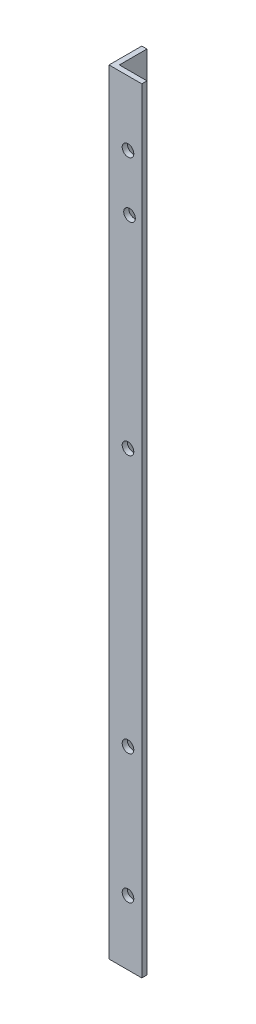
ISO-10303-21;
HEADER;
FILE_DESCRIPTION(('STEP AP214'),'2;1');
FILE_NAME('part.step','',(''),(''),'','','');
FILE_SCHEMA(('AUTOMOTIVE_DESIGN { 1 0 10303 214 1 1 1 1 }'));
ENDSEC;
DATA;
#1=APPLICATION_CONTEXT('core data for automotive mechanical design processes');
#2=APPLICATION_PROTOCOL_DEFINITION('international standard','automotive_design',2000,#1);
#3=PRODUCT_CONTEXT('',#1,'mechanical');
#4=PRODUCT('Part','Part','',(#3));
#5=PRODUCT_RELATED_PRODUCT_CATEGORY('part','',(#4));
#6=PRODUCT_DEFINITION_FORMATION('','',#4);
#7=PRODUCT_DEFINITION_CONTEXT('part definition',#1,'design');
#8=PRODUCT_DEFINITION('design','',#6,#7);
#9=PRODUCT_DEFINITION_SHAPE('','',#8);
#10=(LENGTH_UNIT() NAMED_UNIT(*) SI_UNIT(.MILLI.,.METRE.));
#11=(NAMED_UNIT(*) PLANE_ANGLE_UNIT() SI_UNIT($,.RADIAN.));
#12=(NAMED_UNIT(*) SI_UNIT($,.STERADIAN.) SOLID_ANGLE_UNIT());
#13=UNCERTAINTY_MEASURE_WITH_UNIT(LENGTH_MEASURE(1.E-05),#10,'distance_accuracy_value','');
#14=(GEOMETRIC_REPRESENTATION_CONTEXT(3) GLOBAL_UNCERTAINTY_ASSIGNED_CONTEXT((#13)) GLOBAL_UNIT_ASSIGNED_CONTEXT((#10,
#11,#12)) REPRESENTATION_CONTEXT('',''));
#15=CARTESIAN_POINT('',(0.,0.,0.));
#16=DIRECTION('',(0.,0.,1.));
#17=DIRECTION('',(1.,0.,0.));
#18=AXIS2_PLACEMENT_3D('',#15,#16,#17);
#19=CARTESIAN_POINT('',(0.,300.,0.));
#20=DIRECTION('',(1.,0.,0.));
#21=DIRECTION('',(0.,0.,-1.));
#22=AXIS2_PLACEMENT_3D('',#19,#20,#21);
#23=PLANE('',#22);
#24=CARTESIAN_POINT('',(0.,225.,-7.35000000000001));
#25=DIRECTION('',(1.,0.,0.));
#26=DIRECTION('',(0.,0.,-1.));
#27=AXIS2_PLACEMENT_3D('',#24,#25,#26);
#28=CIRCLE('',#27,2.25);
#29=CARTESIAN_POINT('',(0.,225.,-9.60000000000001));
#30=VERTEX_POINT('',#29);
#31=EDGE_CURVE('E167',#30,#30,#28,.T.);
#32=ORIENTED_EDGE('',*,*,#31,.T.);
#33=EDGE_LOOP('',(#32));
#34=FACE_BOUND('',#33,.T.);
#35=CARTESIAN_POINT('',(0.,125.,-7.35000000000001));
#36=DIRECTION('',(1.,0.,0.));
#37=DIRECTION('',(0.,0.,-1.));
#38=AXIS2_PLACEMENT_3D('',#35,#36,#37);
#39=CIRCLE('',#38,2.25);
#40=CARTESIAN_POINT('',(0.,125.,-9.60000000000001));
#41=VERTEX_POINT('',#40);
#42=EDGE_CURVE('E164',#41,#41,#39,.T.);
#43=ORIENTED_EDGE('',*,*,#42,.T.);
#44=EDGE_LOOP('',(#43));
#45=FACE_BOUND('',#44,.T.);
#46=CARTESIAN_POINT('',(0.,25.,-7.35000000000001));
#47=DIRECTION('',(1.,0.,0.));
#48=DIRECTION('',(0.,0.,-1.));
#49=AXIS2_PLACEMENT_3D('',#46,#47,#48);
#50=CIRCLE('',#49,2.25);
#51=CARTESIAN_POINT('',(0.,25.,-9.60000000000001));
#52=VERTEX_POINT('',#51);
#53=EDGE_CURVE('E156',#52,#52,#50,.T.);
#54=ORIENTED_EDGE('',*,*,#53,.T.);
#55=EDGE_LOOP('',(#54));
#56=FACE_BOUND('',#55,.T.);
#57=DIRECTION('',(0.,0.,1.));
#58=VECTOR('',#57,1.);
#59=CARTESIAN_POINT('',(0.,0.,0.));
#60=LINE('',#59,#58);
#61=CARTESIAN_POINT('',(0.,0.,-12.7));
#62=VERTEX_POINT('',#61);
#63=CARTESIAN_POINT('',(0.,0.,0.));
#64=VERTEX_POINT('',#63);
#65=EDGE_CURVE('E122',#62,#64,#60,.T.);
#66=ORIENTED_EDGE('',*,*,#65,.T.);
#67=DIRECTION('',(0.,-1.,0.));
#68=VECTOR('',#67,1.);
#69=CARTESIAN_POINT('',(0.,300.,0.));
#70=LINE('',#69,#68);
#71=CARTESIAN_POINT('',(0.,300.,0.));
#72=VERTEX_POINT('',#71);
#73=EDGE_CURVE('E11',#72,#64,#70,.T.);
#74=ORIENTED_EDGE('',*,*,#73,.F.);
#75=DIRECTION('',(0.,0.,1.));
#76=VECTOR('',#75,1.);
#77=CARTESIAN_POINT('',(0.,300.,0.));
#78=LINE('',#77,#76);
#79=CARTESIAN_POINT('',(0.,300.,-12.7));
#80=VERTEX_POINT('',#79);
#81=EDGE_CURVE('E133',#80,#72,#78,.T.);
#82=ORIENTED_EDGE('',*,*,#81,.F.);
#83=DIRECTION('',(0.,-1.,0.));
#84=VECTOR('',#83,1.);
#85=CARTESIAN_POINT('',(0.,300.,-12.7));
#86=LINE('',#85,#84);
#87=EDGE_CURVE('E118',#80,#62,#86,.T.);
#88=ORIENTED_EDGE('',*,*,#87,.T.);
#89=EDGE_LOOP('',(#66,#74,#82,#88));
#90=FACE_BOUND('',#89,.T.);
#91=ADVANCED_FACE('F36',(#34,#45,#56,#90),#23,.F.);
#92=CARTESIAN_POINT('',(0.,300.,0.));
#93=DIRECTION('',(0.,0.,-1.));
#94=DIRECTION('',(-1.,0.,0.));
#95=AXIS2_PLACEMENT_3D('',#92,#93,#94);
#96=PLANE('',#95);
#97=CARTESIAN_POINT('',(7.94000000000001,253.6,0.));
#98=DIRECTION('',(0.,0.,1.));
#99=DIRECTION('',(1.,0.,0.));
#100=AXIS2_PLACEMENT_3D('',#97,#98,#99);
#101=CIRCLE('',#100,2.25);
#102=CARTESIAN_POINT('',(10.19,253.6,0.));
#103=VERTEX_POINT('',#102);
#104=EDGE_CURVE('E140',#103,#103,#101,.T.);
#105=ORIENTED_EDGE('',*,*,#104,.F.);
#106=EDGE_LOOP('',(#105));
#107=FACE_BOUND('',#106,.T.);
#108=CARTESIAN_POINT('',(7.35000000000001,25.,0.));
#109=DIRECTION('',(0.,0.,1.));
#110=DIRECTION('',(1.,0.,0.));
#111=AXIS2_PLACEMENT_3D('',#108,#109,#110);
#112=CIRCLE('',#111,2.25);
#113=CARTESIAN_POINT('',(9.60000000000001,25.,0.));
#114=VERTEX_POINT('',#113);
#115=EDGE_CURVE('E146',#114,#114,#112,.T.);
#116=ORIENTED_EDGE('',*,*,#115,.F.);
#117=EDGE_LOOP('',(#116));
#118=FACE_BOUND('',#117,.T.);
#119=CARTESIAN_POINT('',(7.35,275.,0.));
#120=DIRECTION('',(0.,0.,-1.));
#121=DIRECTION('',(-1.,0.,0.));
#122=AXIS2_PLACEMENT_3D('',#119,#120,#121);
#123=CIRCLE('',#122,2.25);
#124=CARTESIAN_POINT('',(5.09999999999999,275.,0.));
#125=VERTEX_POINT('',#124);
#126=EDGE_CURVE('E126',#125,#125,#123,.T.);
#127=ORIENTED_EDGE('',*,*,#126,.T.);
#128=EDGE_LOOP('',(#127));
#129=FACE_BOUND('',#128,.T.);
#130=CARTESIAN_POINT('',(7.35,175.,0.));
#131=DIRECTION('',(0.,0.,-1.));
#132=DIRECTION('',(-1.,0.,0.));
#133=AXIS2_PLACEMENT_3D('',#130,#131,#132);
#134=CIRCLE('',#133,2.25);
#135=CARTESIAN_POINT('',(5.09999999999999,175.,0.));
#136=VERTEX_POINT('',#135);
#137=EDGE_CURVE('E182',#136,#136,#134,.T.);
#138=ORIENTED_EDGE('',*,*,#137,.T.);
#139=EDGE_LOOP('',(#138));
#140=FACE_BOUND('',#139,.T.);
#141=CARTESIAN_POINT('',(7.35,75.,0.));
#142=DIRECTION('',(0.,0.,-1.));
#143=DIRECTION('',(-1.,0.,0.));
#144=AXIS2_PLACEMENT_3D('',#141,#142,#143);
#145=CIRCLE('',#144,2.25);
#146=CARTESIAN_POINT('',(5.09999999999999,75.,0.));
#147=VERTEX_POINT('',#146);
#148=EDGE_CURVE('E174',#147,#147,#145,.T.);
#149=ORIENTED_EDGE('',*,*,#148,.T.);
#150=EDGE_LOOP('',(#149));
#151=FACE_BOUND('',#150,.T.);
#152=DIRECTION('',(1.,0.,0.));
#153=VECTOR('',#152,1.);
#154=CARTESIAN_POINT('',(0.,0.,0.));
#155=LINE('',#154,#153);
#156=CARTESIAN_POINT('',(12.7,0.,0.));
#157=VERTEX_POINT('',#156);
#158=EDGE_CURVE('E125',#64,#157,#155,.T.);
#159=ORIENTED_EDGE('',*,*,#158,.T.);
#160=DIRECTION('',(0.,-1.,0.));
#161=VECTOR('',#160,1.);
#162=CARTESIAN_POINT('',(12.7,300.,0.));
#163=LINE('',#162,#161);
#164=CARTESIAN_POINT('',(12.7,300.,0.));
#165=VERTEX_POINT('',#164);
#166=EDGE_CURVE('E45',#165,#157,#163,.T.);
#167=ORIENTED_EDGE('',*,*,#166,.F.);
#168=DIRECTION('',(1.,0.,0.));
#169=VECTOR('',#168,1.);
#170=CARTESIAN_POINT('',(0.,300.,0.));
#171=LINE('',#170,#169);
#172=EDGE_CURVE('E91',#72,#165,#171,.T.);
#173=ORIENTED_EDGE('',*,*,#172,.F.);
#174=ORIENTED_EDGE('',*,*,#73,.T.);
#175=EDGE_LOOP('',(#159,#167,#173,#174));
#176=FACE_BOUND('',#175,.T.);
#177=ADVANCED_FACE('F190',(#107,#118,#129,#140,#151,#176),#96,.F.);
#178=CARTESIAN_POINT('',(12.7,300.,0.));
#179=DIRECTION('',(-1.,0.,0.));
#180=DIRECTION('',(0.,0.,1.));
#181=AXIS2_PLACEMENT_3D('',#178,#179,#180);
#182=PLANE('',#181);
#183=DIRECTION('',(0.,0.,-1.));
#184=VECTOR('',#183,1.);
#185=CARTESIAN_POINT('',(12.7,0.,0.));
#186=LINE('',#185,#184);
#187=CARTESIAN_POINT('',(12.7,0.,-2.));
#188=VERTEX_POINT('',#187);
#189=EDGE_CURVE('E128',#157,#188,#186,.T.);
#190=ORIENTED_EDGE('',*,*,#189,.T.);
#191=DIRECTION('',(0.,-1.,0.));
#192=VECTOR('',#191,1.);
#193=CARTESIAN_POINT('',(12.7,300.,-2.));
#194=LINE('',#193,#192);
#195=CARTESIAN_POINT('',(12.7,300.,-2.));
#196=VERTEX_POINT('',#195);
#197=EDGE_CURVE('E113',#196,#188,#194,.T.);
#198=ORIENTED_EDGE('',*,*,#197,.F.);
#199=DIRECTION('',(0.,0.,-1.));
#200=VECTOR('',#199,1.);
#201=CARTESIAN_POINT('',(12.7,300.,0.));
#202=LINE('',#201,#200);
#203=EDGE_CURVE('E104',#165,#196,#202,.T.);
#204=ORIENTED_EDGE('',*,*,#203,.F.);
#205=ORIENTED_EDGE('',*,*,#166,.T.);
#206=EDGE_LOOP('',(#190,#198,#204,#205));
#207=FACE_BOUND('',#206,.T.);
#208=ADVANCED_FACE('F193',(#207),#182,.F.);
#209=CARTESIAN_POINT('',(2.,300.,-2.));
#210=DIRECTION('',(0.,0.,1.));
#211=DIRECTION('',(1.,0.,0.));
#212=AXIS2_PLACEMENT_3D('',#209,#210,#211);
#213=PLANE('',#212);
#214=CARTESIAN_POINT('',(7.94000000000001,253.6,-2.));
#215=DIRECTION('',(0.,0.,1.));
#216=DIRECTION('',(1.,0.,0.));
#217=AXIS2_PLACEMENT_3D('',#214,#215,#216);
#218=CIRCLE('',#217,2.25);
#219=CARTESIAN_POINT('',(10.19,253.6,-2.));
#220=VERTEX_POINT('',#219);
#221=EDGE_CURVE('E39',#220,#220,#218,.T.);
#222=ORIENTED_EDGE('',*,*,#221,.T.);
#223=EDGE_LOOP('',(#222));
#224=FACE_BOUND('',#223,.T.);
#225=CARTESIAN_POINT('',(7.35000000000001,25.,-2.));
#226=DIRECTION('',(0.,0.,1.));
#227=DIRECTION('',(1.,0.,0.));
#228=AXIS2_PLACEMENT_3D('',#225,#226,#227);
#229=CIRCLE('',#228,2.25);
#230=CARTESIAN_POINT('',(9.60000000000001,25.,-2.));
#231=VERTEX_POINT('',#230);
#232=EDGE_CURVE('E138',#231,#231,#229,.T.);
#233=ORIENTED_EDGE('',*,*,#232,.T.);
#234=EDGE_LOOP('',(#233));
#235=FACE_BOUND('',#234,.T.);
#236=CARTESIAN_POINT('',(7.35,275.,-2.));
#237=DIRECTION('',(0.,0.,-1.));
#238=DIRECTION('',(-1.,0.,0.));
#239=AXIS2_PLACEMENT_3D('',#236,#237,#238);
#240=CIRCLE('',#239,2.25);
#241=CARTESIAN_POINT('',(5.09999999999999,275.,-2.));
#242=VERTEX_POINT('',#241);
#243=EDGE_CURVE('E171',#242,#242,#240,.T.);
#244=ORIENTED_EDGE('',*,*,#243,.F.);
#245=EDGE_LOOP('',(#244));
#246=FACE_BOUND('',#245,.T.);
#247=CARTESIAN_POINT('',(7.35,175.,-2.));
#248=DIRECTION('',(0.,0.,-1.));
#249=DIRECTION('',(-1.,0.,0.));
#250=AXIS2_PLACEMENT_3D('',#247,#248,#249);
#251=CIRCLE('',#250,2.25);
#252=CARTESIAN_POINT('',(5.09999999999999,175.,-2.));
#253=VERTEX_POINT('',#252);
#254=EDGE_CURVE('E175',#253,#253,#251,.T.);
#255=ORIENTED_EDGE('',*,*,#254,.F.);
#256=EDGE_LOOP('',(#255));
#257=FACE_BOUND('',#256,.T.);
#258=CARTESIAN_POINT('',(7.35,75.,-2.));
#259=DIRECTION('',(0.,0.,-1.));
#260=DIRECTION('',(-1.,0.,0.));
#261=AXIS2_PLACEMENT_3D('',#258,#259,#260);
#262=CIRCLE('',#261,2.25);
#263=CARTESIAN_POINT('',(5.09999999999999,75.,-2.));
#264=VERTEX_POINT('',#263);
#265=EDGE_CURVE('E170',#264,#264,#262,.T.);
#266=ORIENTED_EDGE('',*,*,#265,.F.);
#267=EDGE_LOOP('',(#266));
#268=FACE_BOUND('',#267,.T.);
#269=DIRECTION('',(-1.,0.,0.));
#270=VECTOR('',#269,1.);
#271=CARTESIAN_POINT('',(2.,0.,-2.));
#272=LINE('',#271,#270);
#273=CARTESIAN_POINT('',(2.,0.,-2.));
#274=VERTEX_POINT('',#273);
#275=EDGE_CURVE('E112',#188,#274,#272,.T.);
#276=ORIENTED_EDGE('',*,*,#275,.T.);
#277=DIRECTION('',(0.,-1.,0.));
#278=VECTOR('',#277,1.);
#279=CARTESIAN_POINT('',(2.,300.,-2.));
#280=LINE('',#279,#278);
#281=CARTESIAN_POINT('',(2.,300.,-2.));
#282=VERTEX_POINT('',#281);
#283=EDGE_CURVE('E109',#282,#274,#280,.T.);
#284=ORIENTED_EDGE('',*,*,#283,.F.);
#285=DIRECTION('',(-1.,0.,0.));
#286=VECTOR('',#285,1.);
#287=CARTESIAN_POINT('',(2.,300.,-2.));
#288=LINE('',#287,#286);
#289=EDGE_CURVE('E98',#196,#282,#288,.T.);
#290=ORIENTED_EDGE('',*,*,#289,.F.);
#291=ORIENTED_EDGE('',*,*,#197,.T.);
#292=EDGE_LOOP('',(#276,#284,#290,#291));
#293=FACE_BOUND('',#292,.T.);
#294=ADVANCED_FACE('F110',(#224,#235,#246,#257,#268,#293),#213,.F.);
#295=CARTESIAN_POINT('',(2.,300.,-2.));
#296=DIRECTION('',(-1.,0.,0.));
#297=DIRECTION('',(0.,0.,1.));
#298=AXIS2_PLACEMENT_3D('',#295,#296,#297);
#299=PLANE('',#298);
#300=CARTESIAN_POINT('',(2.,225.,-7.35000000000001));
#301=DIRECTION('',(1.,0.,0.));
#302=DIRECTION('',(0.,0.,-1.));
#303=AXIS2_PLACEMENT_3D('',#300,#301,#302);
#304=CIRCLE('',#303,2.25);
#305=CARTESIAN_POINT('',(2.,225.,-9.60000000000001));
#306=VERTEX_POINT('',#305);
#307=EDGE_CURVE('E153',#306,#306,#304,.T.);
#308=ORIENTED_EDGE('',*,*,#307,.F.);
#309=EDGE_LOOP('',(#308));
#310=FACE_BOUND('',#309,.T.);
#311=CARTESIAN_POINT('',(2.,125.,-7.35000000000001));
#312=DIRECTION('',(1.,0.,0.));
#313=DIRECTION('',(0.,0.,-1.));
#314=AXIS2_PLACEMENT_3D('',#311,#312,#313);
#315=CIRCLE('',#314,2.25);
#316=CARTESIAN_POINT('',(2.,125.,-9.60000000000001));
#317=VERTEX_POINT('',#316);
#318=EDGE_CURVE('E157',#317,#317,#315,.T.);
#319=ORIENTED_EDGE('',*,*,#318,.F.);
#320=EDGE_LOOP('',(#319));
#321=FACE_BOUND('',#320,.T.);
#322=CARTESIAN_POINT('',(2.,25.,-7.35000000000001));
#323=DIRECTION('',(1.,0.,0.));
#324=DIRECTION('',(0.,0.,-1.));
#325=AXIS2_PLACEMENT_3D('',#322,#323,#324);
#326=CIRCLE('',#325,2.25);
#327=CARTESIAN_POINT('',(2.,25.,-9.60000000000001));
#328=VERTEX_POINT('',#327);
#329=EDGE_CURVE('E144',#328,#328,#326,.T.);
#330=ORIENTED_EDGE('',*,*,#329,.F.);
#331=EDGE_LOOP('',(#330));
#332=FACE_BOUND('',#331,.T.);
#333=DIRECTION('',(0.,0.,-1.));
#334=VECTOR('',#333,1.);
#335=CARTESIAN_POINT('',(2.,0.,-2.));
#336=LINE('',#335,#334);
#337=CARTESIAN_POINT('',(2.,0.,-12.7));
#338=VERTEX_POINT('',#337);
#339=EDGE_CURVE('E77',#274,#338,#336,.T.);
#340=ORIENTED_EDGE('',*,*,#339,.T.);
#341=DIRECTION('',(0.,-1.,0.));
#342=VECTOR('',#341,1.);
#343=CARTESIAN_POINT('',(2.,300.,-12.7));
#344=LINE('',#343,#342);
#345=CARTESIAN_POINT('',(2.,300.,-12.7));
#346=VERTEX_POINT('',#345);
#347=EDGE_CURVE('E114',#346,#338,#344,.T.);
#348=ORIENTED_EDGE('',*,*,#347,.F.);
#349=DIRECTION('',(0.,0.,-1.));
#350=VECTOR('',#349,1.);
#351=CARTESIAN_POINT('',(2.,300.,-2.));
#352=LINE('',#351,#350);
#353=EDGE_CURVE('E102',#282,#346,#352,.T.);
#354=ORIENTED_EDGE('',*,*,#353,.F.);
#355=ORIENTED_EDGE('',*,*,#283,.T.);
#356=EDGE_LOOP('',(#340,#348,#354,#355));
#357=FACE_BOUND('',#356,.T.);
#358=ADVANCED_FACE('F116',(#310,#321,#332,#357),#299,.F.);
#359=CARTESIAN_POINT('',(0.,300.,-12.7));
#360=DIRECTION('',(0.,0.,1.));
#361=DIRECTION('',(1.,0.,0.));
#362=AXIS2_PLACEMENT_3D('',#359,#360,#361);
#363=PLANE('',#362);
#364=DIRECTION('',(-1.,0.,0.));
#365=VECTOR('',#364,1.);
#366=CARTESIAN_POINT('',(0.,0.,-12.7));
#367=LINE('',#366,#365);
#368=EDGE_CURVE('E83',#338,#62,#367,.T.);
#369=ORIENTED_EDGE('',*,*,#368,.T.);
#370=ORIENTED_EDGE('',*,*,#87,.F.);
#371=DIRECTION('',(-1.,0.,0.));
#372=VECTOR('',#371,1.);
#373=CARTESIAN_POINT('',(0.,300.,-12.7));
#374=LINE('',#373,#372);
#375=EDGE_CURVE('E54',#346,#80,#374,.T.);
#376=ORIENTED_EDGE('',*,*,#375,.F.);
#377=ORIENTED_EDGE('',*,*,#347,.T.);
#378=EDGE_LOOP('',(#369,#370,#376,#377));
#379=FACE_BOUND('',#378,.T.);
#380=ADVANCED_FACE('F198',(#379),#363,.F.);
#381=CARTESIAN_POINT('',(0.,300.,0.));
#382=DIRECTION('',(0.,-1.,0.));
#383=DIRECTION('',(0.,0.,-1.));
#384=AXIS2_PLACEMENT_3D('',#381,#382,#383);
#385=PLANE('',#384);
#386=ORIENTED_EDGE('',*,*,#81,.T.);
#387=ORIENTED_EDGE('',*,*,#172,.T.);
#388=ORIENTED_EDGE('',*,*,#203,.T.);
#389=ORIENTED_EDGE('',*,*,#289,.T.);
#390=ORIENTED_EDGE('',*,*,#353,.T.);
#391=ORIENTED_EDGE('',*,*,#375,.T.);
#392=EDGE_LOOP('',(#386,#387,#388,#389,#390,#391));
#393=FACE_BOUND('',#392,.T.);
#394=ADVANCED_FACE('F100',(#393),#385,.F.);
#395=CARTESIAN_POINT('',(0.,0.,0.));
#396=DIRECTION('',(0.,-1.,0.));
#397=DIRECTION('',(0.,0.,-1.));
#398=AXIS2_PLACEMENT_3D('',#395,#396,#397);
#399=PLANE('',#398);
#400=ORIENTED_EDGE('',*,*,#65,.F.);
#401=ORIENTED_EDGE('',*,*,#368,.F.);
#402=ORIENTED_EDGE('',*,*,#339,.F.);
#403=ORIENTED_EDGE('',*,*,#275,.F.);
#404=ORIENTED_EDGE('',*,*,#189,.F.);
#405=ORIENTED_EDGE('',*,*,#158,.F.);
#406=EDGE_LOOP('',(#400,#401,#402,#403,#404,#405));
#407=FACE_BOUND('',#406,.T.);
#408=ADVANCED_FACE('F196',(#407),#399,.T.);
#409=CARTESIAN_POINT('',(7.35,75.,298.));
#410=DIRECTION('',(0.,0.,-1.));
#411=DIRECTION('',(-1.,0.,0.));
#412=AXIS2_PLACEMENT_3D('',#409,#410,#411);
#413=CYLINDRICAL_SURFACE('',#412,2.25);
#414=ORIENTED_EDGE('',*,*,#265,.T.);
#415=EDGE_LOOP('',(#414));
#416=FACE_BOUND('',#415,.T.);
#417=ORIENTED_EDGE('',*,*,#148,.F.);
#418=EDGE_LOOP('',(#417));
#419=FACE_BOUND('',#418,.T.);
#420=ADVANCED_FACE('F241',(#416,#419),#413,.F.);
#421=CARTESIAN_POINT('',(7.35,175.,298.));
#422=DIRECTION('',(0.,0.,-1.));
#423=DIRECTION('',(-1.,0.,0.));
#424=AXIS2_PLACEMENT_3D('',#421,#422,#423);
#425=CYLINDRICAL_SURFACE('',#424,2.25);
#426=ORIENTED_EDGE('',*,*,#254,.T.);
#427=EDGE_LOOP('',(#426));
#428=FACE_BOUND('',#427,.T.);
#429=ORIENTED_EDGE('',*,*,#137,.F.);
#430=EDGE_LOOP('',(#429));
#431=FACE_BOUND('',#430,.T.);
#432=ADVANCED_FACE('F234',(#428,#431),#425,.F.);
#433=CARTESIAN_POINT('',(7.35,275.,298.));
#434=DIRECTION('',(0.,0.,-1.));
#435=DIRECTION('',(-1.,0.,0.));
#436=AXIS2_PLACEMENT_3D('',#433,#434,#435);
#437=CYLINDRICAL_SURFACE('',#436,2.25);
#438=ORIENTED_EDGE('',*,*,#243,.T.);
#439=EDGE_LOOP('',(#438));
#440=FACE_BOUND('',#439,.T.);
#441=ORIENTED_EDGE('',*,*,#126,.F.);
#442=EDGE_LOOP('',(#441));
#443=FACE_BOUND('',#442,.T.);
#444=ADVANCED_FACE('F224',(#440,#443),#437,.F.);
#445=CARTESIAN_POINT('',(-8.,25.,-7.35000000000001));
#446=DIRECTION('',(1.,0.,0.));
#447=DIRECTION('',(0.,0.,-1.));
#448=AXIS2_PLACEMENT_3D('',#445,#446,#447);
#449=CYLINDRICAL_SURFACE('',#448,2.25);
#450=ORIENTED_EDGE('',*,*,#329,.T.);
#451=EDGE_LOOP('',(#450));
#452=FACE_BOUND('',#451,.T.);
#453=ORIENTED_EDGE('',*,*,#53,.F.);
#454=EDGE_LOOP('',(#453));
#455=FACE_BOUND('',#454,.T.);
#456=ADVANCED_FACE('F221',(#452,#455),#449,.F.);
#457=CARTESIAN_POINT('',(-8.,125.,-7.35000000000001));
#458=DIRECTION('',(1.,0.,0.));
#459=DIRECTION('',(0.,0.,-1.));
#460=AXIS2_PLACEMENT_3D('',#457,#458,#459);
#461=CYLINDRICAL_SURFACE('',#460,2.25);
#462=ORIENTED_EDGE('',*,*,#318,.T.);
#463=EDGE_LOOP('',(#462));
#464=FACE_BOUND('',#463,.T.);
#465=ORIENTED_EDGE('',*,*,#42,.F.);
#466=EDGE_LOOP('',(#465));
#467=FACE_BOUND('',#466,.T.);
#468=ADVANCED_FACE('F223',(#464,#467),#461,.F.);
#469=CARTESIAN_POINT('',(-8.,225.,-7.35000000000001));
#470=DIRECTION('',(1.,0.,0.));
#471=DIRECTION('',(0.,0.,-1.));
#472=AXIS2_PLACEMENT_3D('',#469,#470,#471);
#473=CYLINDRICAL_SURFACE('',#472,2.25);
#474=ORIENTED_EDGE('',*,*,#307,.T.);
#475=EDGE_LOOP('',(#474));
#476=FACE_BOUND('',#475,.T.);
#477=ORIENTED_EDGE('',*,*,#31,.F.);
#478=EDGE_LOOP('',(#477));
#479=FACE_BOUND('',#478,.T.);
#480=ADVANCED_FACE('F231',(#476,#479),#473,.F.);
#481=CARTESIAN_POINT('',(7.35000000000001,25.,-10.));
#482=DIRECTION('',(0.,0.,1.));
#483=DIRECTION('',(1.,0.,0.));
#484=AXIS2_PLACEMENT_3D('',#481,#482,#483);
#485=CYLINDRICAL_SURFACE('',#484,2.25);
#486=ORIENTED_EDGE('',*,*,#115,.T.);
#487=EDGE_LOOP('',(#486));
#488=FACE_BOUND('',#487,.T.);
#489=ORIENTED_EDGE('',*,*,#232,.F.);
#490=EDGE_LOOP('',(#489));
#491=FACE_BOUND('',#490,.T.);
#492=ADVANCED_FACE('F300',(#488,#491),#485,.F.);
#493=CARTESIAN_POINT('',(7.94000000000001,253.6,-10.));
#494=DIRECTION('',(0.,0.,1.));
#495=DIRECTION('',(1.,0.,0.));
#496=AXIS2_PLACEMENT_3D('',#493,#494,#495);
#497=CYLINDRICAL_SURFACE('',#496,2.25);
#498=ORIENTED_EDGE('',*,*,#104,.T.);
#499=EDGE_LOOP('',(#498));
#500=FACE_BOUND('',#499,.T.);
#501=ORIENTED_EDGE('',*,*,#221,.F.);
#502=EDGE_LOOP('',(#501));
#503=FACE_BOUND('',#502,.T.);
#504=ADVANCED_FACE('F326',(#500,#503),#497,.F.);
#505=CLOSED_SHELL('',(#91,#177,#208,#294,#358,#380,#394,#408,#420,#432,#444,#456,#468,#480,#492,#504));
#506=MANIFOLD_SOLID_BREP('B2',#505);
#507=ADVANCED_BREP_SHAPE_REPRESENTATION('',(#18,#506),#14);
#508=SHAPE_DEFINITION_REPRESENTATION(#9,#507);
ENDSEC;
END-ISO-10303-21;
